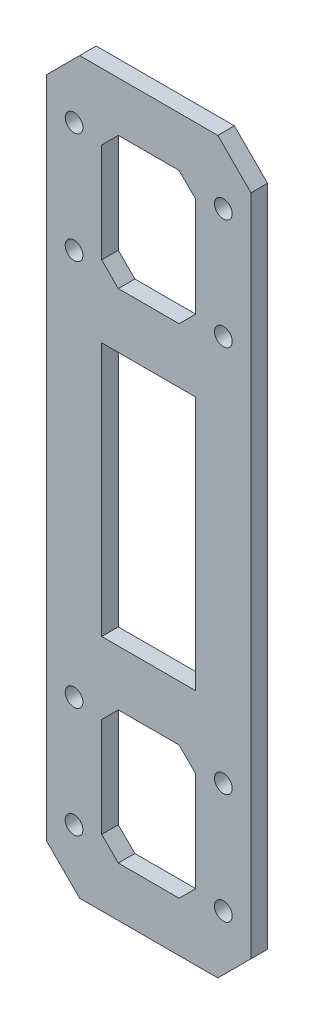
ISO-10303-21;
HEADER;
FILE_DESCRIPTION(('STEP AP214'),'2;1');
FILE_NAME('part.step','',(''),(''),'','','');
FILE_SCHEMA(('AUTOMOTIVE_DESIGN { 1 0 10303 214 1 1 1 1 }'));
ENDSEC;
DATA;
#1=APPLICATION_CONTEXT('core data for automotive mechanical design processes');
#2=APPLICATION_PROTOCOL_DEFINITION('international standard','automotive_design',2000,#1);
#3=PRODUCT_CONTEXT('',#1,'mechanical');
#4=PRODUCT('Part','Part','',(#3));
#5=PRODUCT_RELATED_PRODUCT_CATEGORY('part','',(#4));
#6=PRODUCT_DEFINITION_FORMATION('','',#4);
#7=PRODUCT_DEFINITION_CONTEXT('part definition',#1,'design');
#8=PRODUCT_DEFINITION('design','',#6,#7);
#9=PRODUCT_DEFINITION_SHAPE('','',#8);
#10=(LENGTH_UNIT() NAMED_UNIT(*) SI_UNIT(.MILLI.,.METRE.));
#11=(NAMED_UNIT(*) PLANE_ANGLE_UNIT() SI_UNIT($,.RADIAN.));
#12=(NAMED_UNIT(*) SI_UNIT($,.STERADIAN.) SOLID_ANGLE_UNIT());
#13=UNCERTAINTY_MEASURE_WITH_UNIT(LENGTH_MEASURE(1.E-05),#10,'distance_accuracy_value','');
#14=(GEOMETRIC_REPRESENTATION_CONTEXT(3) GLOBAL_UNCERTAINTY_ASSIGNED_CONTEXT((#13)) GLOBAL_UNIT_ASSIGNED_CONTEXT((#10,
#11,#12)) REPRESENTATION_CONTEXT('',''));
#15=CARTESIAN_POINT('',(0.,0.,0.));
#16=DIRECTION('',(0.,0.,1.));
#17=DIRECTION('',(1.,0.,0.));
#18=AXIS2_PLACEMENT_3D('',#15,#16,#17);
#19=CARTESIAN_POINT('',(0.,0.,3.));
#20=DIRECTION('',(0.,0.,-1.));
#21=DIRECTION('',(-1.,0.,0.));
#22=AXIS2_PLACEMENT_3D('',#19,#20,#21);
#23=PLANE('',#22);
#24=DIRECTION('',(1.,0.,0.));
#25=VECTOR('',#24,1.);
#26=CARTESIAN_POINT('',(10.,37.,3.));
#27=LINE('',#26,#25);
#28=CARTESIAN_POINT('',(10.,37.,3.));
#29=VERTEX_POINT('',#28);
#30=CARTESIAN_POINT('',(27.,37.,3.));
#31=VERTEX_POINT('',#30);
#32=EDGE_CURVE('E232',#29,#31,#27,.T.);
#33=ORIENTED_EDGE('',*,*,#32,.F.);
#34=DIRECTION('',(0.,-1.,0.));
#35=VECTOR('',#34,1.);
#36=CARTESIAN_POINT('',(10.,83.,3.));
#37=LINE('',#36,#35);
#38=CARTESIAN_POINT('',(10.,83.,3.));
#39=VERTEX_POINT('',#38);
#40=EDGE_CURVE('E51',#39,#29,#37,.T.);
#41=ORIENTED_EDGE('',*,*,#40,.F.);
#42=DIRECTION('',(-1.,0.,0.));
#43=VECTOR('',#42,1.);
#44=CARTESIAN_POINT('',(10.,83.,3.));
#45=LINE('',#44,#43);
#46=CARTESIAN_POINT('',(27.,83.,3.));
#47=VERTEX_POINT('',#46);
#48=EDGE_CURVE('E238',#47,#39,#45,.T.);
#49=ORIENTED_EDGE('',*,*,#48,.F.);
#50=DIRECTION('',(0.,1.,0.));
#51=VECTOR('',#50,1.);
#52=CARTESIAN_POINT('',(27.,83.,3.));
#53=LINE('',#52,#51);
#54=EDGE_CURVE('E223',#31,#47,#53,.T.);
#55=ORIENTED_EDGE('',*,*,#54,.F.);
#56=EDGE_LOOP('',(#33,#41,#49,#55));
#57=FACE_BOUND('',#56,.T.);
#58=DIRECTION('',(1.,0.,0.));
#59=VECTOR('',#58,1.);
#60=CARTESIAN_POINT('',(10.,93.,3.));
#61=LINE('',#60,#59);
#62=CARTESIAN_POINT('',(13.,93.,3.));
#63=VERTEX_POINT('',#62);
#64=CARTESIAN_POINT('',(24.,93.,3.));
#65=VERTEX_POINT('',#64);
#66=EDGE_CURVE('E277',#63,#65,#61,.T.);
#67=ORIENTED_EDGE('',*,*,#66,.F.);
#68=DIRECTION('',(0.707106781186552,-0.707106781186543,0.));
#69=VECTOR('',#68,1.);
#70=CARTESIAN_POINT('',(52.9999999999999,53.0000000000007,3.));
#71=LINE('',#70,#69);
#72=CARTESIAN_POINT('',(10.,96.,3.));
#73=VERTEX_POINT('',#72);
#74=EDGE_CURVE('E463',#63,#73,#71,.F.);
#75=ORIENTED_EDGE('',*,*,#74,.T.);
#76=DIRECTION('',(0.,-1.,0.));
#77=VECTOR('',#76,1.);
#78=CARTESIAN_POINT('',(9.99999999999999,117.,3.));
#79=LINE('',#78,#77);
#80=CARTESIAN_POINT('',(10.,114.,3.));
#81=VERTEX_POINT('',#80);
#82=EDGE_CURVE('E274',#81,#73,#79,.T.);
#83=ORIENTED_EDGE('',*,*,#82,.F.);
#84=DIRECTION('',(-0.707106781186544,-0.707106781186551,0.));
#85=VECTOR('',#84,1.);
#86=CARTESIAN_POINT('',(-52.,51.9999999999995,3.));
#87=LINE('',#86,#85);
#88=CARTESIAN_POINT('',(13.,117.,3.));
#89=VERTEX_POINT('',#88);
#90=EDGE_CURVE('E467',#81,#89,#87,.F.);
#91=ORIENTED_EDGE('',*,*,#90,.T.);
#92=DIRECTION('',(-1.,0.,0.));
#93=VECTOR('',#92,1.);
#94=CARTESIAN_POINT('',(9.99999999999999,117.,3.));
#95=LINE('',#94,#93);
#96=CARTESIAN_POINT('',(24.,117.,3.));
#97=VERTEX_POINT('',#96);
#98=EDGE_CURVE('E264',#97,#89,#95,.T.);
#99=ORIENTED_EDGE('',*,*,#98,.F.);
#100=DIRECTION('',(-0.707106781186551,0.707106781186544,0.));
#101=VECTOR('',#100,1.);
#102=CARTESIAN_POINT('',(70.4999999999999,70.5000000000005,3.));
#103=LINE('',#102,#101);
#104=CARTESIAN_POINT('',(27.,114.,3.));
#105=VERTEX_POINT('',#104);
#106=EDGE_CURVE('E471',#97,#105,#103,.F.);
#107=ORIENTED_EDGE('',*,*,#106,.T.);
#108=DIRECTION('',(0.,1.,0.));
#109=VECTOR('',#108,1.);
#110=CARTESIAN_POINT('',(27.,117.,3.));
#111=LINE('',#110,#109);
#112=CARTESIAN_POINT('',(27.,96.,3.));
#113=VERTEX_POINT('',#112);
#114=EDGE_CURVE('E281',#113,#105,#111,.T.);
#115=ORIENTED_EDGE('',*,*,#114,.F.);
#116=DIRECTION('',(0.707106781186544,0.707106781186551,0.));
#117=VECTOR('',#116,1.);
#118=CARTESIAN_POINT('',(-34.4999999999999,34.4999999999996,3.));
#119=LINE('',#118,#117);
#120=EDGE_CURVE('E459',#113,#65,#119,.F.);
#121=ORIENTED_EDGE('',*,*,#120,.T.);
#122=EDGE_LOOP('',(#67,#75,#83,#91,#99,#107,#115,#121));
#123=FACE_BOUND('',#122,.T.);
#124=DIRECTION('',(1.,0.,0.));
#125=VECTOR('',#124,1.);
#126=CARTESIAN_POINT('',(10.,3.00000000000001,3.));
#127=LINE('',#126,#125);
#128=CARTESIAN_POINT('',(13.,3.00000000000001,3.));
#129=VERTEX_POINT('',#128);
#130=CARTESIAN_POINT('',(24.,3.00000000000001,3.));
#131=VERTEX_POINT('',#130);
#132=EDGE_CURVE('E300',#129,#131,#127,.T.);
#133=ORIENTED_EDGE('',*,*,#132,.F.);
#134=DIRECTION('',(0.707106781186552,-0.707106781186543,0.));
#135=VECTOR('',#134,1.);
#136=CARTESIAN_POINT('',(7.99999999999994,8.00000000000005,3.));
#137=LINE('',#136,#135);
#138=CARTESIAN_POINT('',(10.,6.00000000000001,3.));
#139=VERTEX_POINT('',#138);
#140=EDGE_CURVE('E443',#129,#139,#137,.F.);
#141=ORIENTED_EDGE('',*,*,#140,.T.);
#142=DIRECTION('',(0.,-1.,0.));
#143=VECTOR('',#142,1.);
#144=CARTESIAN_POINT('',(10.,27.,3.));
#145=LINE('',#144,#143);
#146=CARTESIAN_POINT('',(10.,24.,3.));
#147=VERTEX_POINT('',#146);
#148=EDGE_CURVE('E257',#147,#139,#145,.T.);
#149=ORIENTED_EDGE('',*,*,#148,.F.);
#150=DIRECTION('',(-0.707106781186544,-0.707106781186551,0.));
#151=VECTOR('',#150,1.);
#152=CARTESIAN_POINT('',(-6.99999999999995,6.99999999999989,3.));
#153=LINE('',#152,#151);
#154=CARTESIAN_POINT('',(13.,27.,3.));
#155=VERTEX_POINT('',#154);
#156=EDGE_CURVE('E455',#147,#155,#153,.F.);
#157=ORIENTED_EDGE('',*,*,#156,.T.);
#158=DIRECTION('',(-1.,0.,0.));
#159=VECTOR('',#158,1.);
#160=CARTESIAN_POINT('',(10.,27.,3.));
#161=LINE('',#160,#159);
#162=CARTESIAN_POINT('',(24.,27.,3.));
#163=VERTEX_POINT('',#162);
#164=EDGE_CURVE('E290',#163,#155,#161,.T.);
#165=ORIENTED_EDGE('',*,*,#164,.F.);
#166=DIRECTION('',(-0.707106781186553,0.707106781186542,0.));
#167=VECTOR('',#166,1.);
#168=CARTESIAN_POINT('',(25.4999999999998,25.5000000000002,3.));
#169=LINE('',#168,#167);
#170=CARTESIAN_POINT('',(27.,24.,3.));
#171=VERTEX_POINT('',#170);
#172=EDGE_CURVE('E451',#163,#171,#169,.F.);
#173=ORIENTED_EDGE('',*,*,#172,.T.);
#174=DIRECTION('',(0.,1.,0.));
#175=VECTOR('',#174,1.);
#176=CARTESIAN_POINT('',(27.,27.,3.));
#177=LINE('',#176,#175);
#178=CARTESIAN_POINT('',(27.,6.00000000000004,3.));
#179=VERTEX_POINT('',#178);
#180=EDGE_CURVE('E303',#179,#171,#177,.T.);
#181=ORIENTED_EDGE('',*,*,#180,.F.);
#182=DIRECTION('',(0.707106781186543,0.707106781186552,0.));
#183=VECTOR('',#182,1.);
#184=CARTESIAN_POINT('',(10.5000000000002,-10.5,3.));
#185=LINE('',#184,#183);
#186=EDGE_CURVE('E447',#179,#131,#185,.F.);
#187=ORIENTED_EDGE('',*,*,#186,.T.);
#188=EDGE_LOOP('',(#133,#141,#149,#157,#165,#173,#181,#187));
#189=FACE_BOUND('',#188,.T.);
#190=DIRECTION('',(0.,1.,0.));
#191=VECTOR('',#190,1.);
#192=CARTESIAN_POINT('',(37.,0.,3.));
#193=LINE('',#192,#191);
#194=CARTESIAN_POINT('',(37.,0.,3.));
#195=VERTEX_POINT('',#194);
#196=CARTESIAN_POINT('',(37.,120.,3.));
#197=VERTEX_POINT('',#196);
#198=EDGE_CURVE('E359',#195,#197,#193,.T.);
#199=ORIENTED_EDGE('',*,*,#198,.T.);
#200=DIRECTION('',(-0.70710678118655,0.707106781186545,0.));
#201=VECTOR('',#200,1.);
#202=CARTESIAN_POINT('',(37.,120.,3.));
#203=LINE('',#202,#201);
#204=CARTESIAN_POINT('',(31.,126.,3.));
#205=VERTEX_POINT('',#204);
#206=EDGE_CURVE('E378',#197,#205,#203,.T.);
#207=ORIENTED_EDGE('',*,*,#206,.T.);
#208=DIRECTION('',(-1.,0.,0.));
#209=VECTOR('',#208,1.);
#210=CARTESIAN_POINT('',(0.,126.,3.));
#211=LINE('',#210,#209);
#212=CARTESIAN_POINT('',(6.00000000000003,126.,3.));
#213=VERTEX_POINT('',#212);
#214=EDGE_CURVE('E251',#205,#213,#211,.T.);
#215=ORIENTED_EDGE('',*,*,#214,.T.);
#216=DIRECTION('',(-0.707106781186548,-0.707106781186548,0.));
#217=VECTOR('',#216,1.);
#218=CARTESIAN_POINT('',(6.00000000000003,126.,3.));
#219=LINE('',#218,#217);
#220=CARTESIAN_POINT('',(0.,120.,3.));
#221=VERTEX_POINT('',#220);
#222=EDGE_CURVE('E376',#213,#221,#219,.T.);
#223=ORIENTED_EDGE('',*,*,#222,.T.);
#224=DIRECTION('',(0.,-1.,0.));
#225=VECTOR('',#224,1.);
#226=CARTESIAN_POINT('',(0.,0.,3.));
#227=LINE('',#226,#225);
#228=CARTESIAN_POINT('',(0.,0.,3.));
#229=VERTEX_POINT('',#228);
#230=EDGE_CURVE('E356',#221,#229,#227,.T.);
#231=ORIENTED_EDGE('',*,*,#230,.T.);
#232=DIRECTION('',(0.70710678118655,-0.707106781186545,0.));
#233=VECTOR('',#232,1.);
#234=CARTESIAN_POINT('',(0.,0.,3.));
#235=LINE('',#234,#233);
#236=CARTESIAN_POINT('',(6.00000000000005,-6.,3.));
#237=VERTEX_POINT('',#236);
#238=EDGE_CURVE('E372',#229,#237,#235,.T.);
#239=ORIENTED_EDGE('',*,*,#238,.T.);
#240=DIRECTION('',(1.,0.,0.));
#241=VECTOR('',#240,1.);
#242=CARTESIAN_POINT('',(0.,-6.,3.));
#243=LINE('',#242,#241);
#244=CARTESIAN_POINT('',(31.,-6.,3.));
#245=VERTEX_POINT('',#244);
#246=EDGE_CURVE('E245',#237,#245,#243,.T.);
#247=ORIENTED_EDGE('',*,*,#246,.T.);
#248=DIRECTION('',(0.707106781186549,0.707106781186546,0.));
#249=VECTOR('',#248,1.);
#250=CARTESIAN_POINT('',(31.,-6.,3.));
#251=LINE('',#250,#249);
#252=EDGE_CURVE('E374',#245,#195,#251,.T.);
#253=ORIENTED_EDGE('',*,*,#252,.T.);
#254=EDGE_LOOP('',(#199,#207,#215,#223,#231,#239,#247,#253));
#255=FACE_BOUND('',#254,.T.);
#256=CARTESIAN_POINT('',(5.,115.,3.));
#257=DIRECTION('',(0.,0.,1.));
#258=DIRECTION('',(1.,0.,0.));
#259=AXIS2_PLACEMENT_3D('',#256,#257,#258);
#260=CIRCLE('',#259,1.6);
#261=CARTESIAN_POINT('',(6.6,115.,3.));
#262=VERTEX_POINT('',#261);
#263=EDGE_CURVE('E350',#262,#262,#260,.T.);
#264=ORIENTED_EDGE('',*,*,#263,.F.);
#265=EDGE_LOOP('',(#264));
#266=FACE_BOUND('',#265,.T.);
#267=CARTESIAN_POINT('',(32.,115.,3.));
#268=DIRECTION('',(0.,0.,1.));
#269=DIRECTION('',(1.,0.,0.));
#270=AXIS2_PLACEMENT_3D('',#267,#268,#269);
#271=CIRCLE('',#270,1.6);
#272=CARTESIAN_POINT('',(33.6,115.,3.));
#273=VERTEX_POINT('',#272);
#274=EDGE_CURVE('E344',#273,#273,#271,.T.);
#275=ORIENTED_EDGE('',*,*,#274,.F.);
#276=EDGE_LOOP('',(#275));
#277=FACE_BOUND('',#276,.T.);
#278=CARTESIAN_POINT('',(5.,95.,3.));
#279=DIRECTION('',(0.,0.,1.));
#280=DIRECTION('',(1.,0.,0.));
#281=AXIS2_PLACEMENT_3D('',#278,#279,#280);
#282=CIRCLE('',#281,1.6);
#283=CARTESIAN_POINT('',(6.6,95.,3.));
#284=VERTEX_POINT('',#283);
#285=EDGE_CURVE('E338',#284,#284,#282,.T.);
#286=ORIENTED_EDGE('',*,*,#285,.F.);
#287=EDGE_LOOP('',(#286));
#288=FACE_BOUND('',#287,.T.);
#289=CARTESIAN_POINT('',(32.,95.,3.));
#290=DIRECTION('',(0.,0.,1.));
#291=DIRECTION('',(1.,0.,0.));
#292=AXIS2_PLACEMENT_3D('',#289,#290,#291);
#293=CIRCLE('',#292,1.60000000000001);
#294=CARTESIAN_POINT('',(33.6,95.,3.));
#295=VERTEX_POINT('',#294);
#296=EDGE_CURVE('E332',#295,#295,#293,.T.);
#297=ORIENTED_EDGE('',*,*,#296,.F.);
#298=EDGE_LOOP('',(#297));
#299=FACE_BOUND('',#298,.T.);
#300=CARTESIAN_POINT('',(5.,25.,3.));
#301=DIRECTION('',(0.,0.,1.));
#302=DIRECTION('',(1.,0.,0.));
#303=AXIS2_PLACEMENT_3D('',#300,#301,#302);
#304=CIRCLE('',#303,1.6);
#305=CARTESIAN_POINT('',(6.6,25.,3.));
#306=VERTEX_POINT('',#305);
#307=EDGE_CURVE('E326',#306,#306,#304,.T.);
#308=ORIENTED_EDGE('',*,*,#307,.F.);
#309=EDGE_LOOP('',(#308));
#310=FACE_BOUND('',#309,.T.);
#311=CARTESIAN_POINT('',(32.,25.,3.));
#312=DIRECTION('',(0.,0.,1.));
#313=DIRECTION('',(1.,0.,0.));
#314=AXIS2_PLACEMENT_3D('',#311,#312,#313);
#315=CIRCLE('',#314,1.6);
#316=CARTESIAN_POINT('',(33.6,25.,3.));
#317=VERTEX_POINT('',#316);
#318=EDGE_CURVE('E320',#317,#317,#315,.T.);
#319=ORIENTED_EDGE('',*,*,#318,.F.);
#320=EDGE_LOOP('',(#319));
#321=FACE_BOUND('',#320,.T.);
#322=CARTESIAN_POINT('',(5.,5.,3.));
#323=DIRECTION('',(0.,0.,1.));
#324=DIRECTION('',(1.,0.,0.));
#325=AXIS2_PLACEMENT_3D('',#322,#323,#324);
#326=CIRCLE('',#325,1.6);
#327=CARTESIAN_POINT('',(6.6,5.,3.));
#328=VERTEX_POINT('',#327);
#329=EDGE_CURVE('E314',#328,#328,#326,.T.);
#330=ORIENTED_EDGE('',*,*,#329,.F.);
#331=EDGE_LOOP('',(#330));
#332=FACE_BOUND('',#331,.T.);
#333=CARTESIAN_POINT('',(32.,5.,3.));
#334=DIRECTION('',(0.,0.,1.));
#335=DIRECTION('',(1.,0.,0.));
#336=AXIS2_PLACEMENT_3D('',#333,#334,#335);
#337=CIRCLE('',#336,1.6);
#338=CARTESIAN_POINT('',(33.6,5.,3.));
#339=VERTEX_POINT('',#338);
#340=EDGE_CURVE('E308',#339,#339,#337,.T.);
#341=ORIENTED_EDGE('',*,*,#340,.F.);
#342=EDGE_LOOP('',(#341));
#343=FACE_BOUND('',#342,.T.);
#344=ADVANCED_FACE('F35',(#57,#123,#189,#255,#266,#277,#288,#299,#310,#321,#332,#343),#23,.F.);
#345=CARTESIAN_POINT('',(0.,0.,0.));
#346=DIRECTION('',(0.,0.,-1.));
#347=DIRECTION('',(-1.,0.,0.));
#348=AXIS2_PLACEMENT_3D('',#345,#346,#347);
#349=PLANE('',#348);
#350=DIRECTION('',(0.,1.,0.));
#351=VECTOR('',#350,1.);
#352=CARTESIAN_POINT('',(10.,0.,0.));
#353=LINE('',#352,#351);
#354=CARTESIAN_POINT('',(10.,37.,0.));
#355=VERTEX_POINT('',#354);
#356=CARTESIAN_POINT('',(10.,83.,0.));
#357=VERTEX_POINT('',#356);
#358=EDGE_CURVE('E11',#355,#357,#353,.T.);
#359=ORIENTED_EDGE('',*,*,#358,.F.);
#360=DIRECTION('',(-1.,0.,0.));
#361=VECTOR('',#360,1.);
#362=CARTESIAN_POINT('',(0.,37.,0.));
#363=LINE('',#362,#361);
#364=CARTESIAN_POINT('',(27.,37.,0.));
#365=VERTEX_POINT('',#364);
#366=EDGE_CURVE('E475',#365,#355,#363,.T.);
#367=ORIENTED_EDGE('',*,*,#366,.F.);
#368=DIRECTION('',(0.,-1.,0.));
#369=VECTOR('',#368,1.);
#370=CARTESIAN_POINT('',(27.,0.,0.));
#371=LINE('',#370,#369);
#372=CARTESIAN_POINT('',(27.,83.,0.));
#373=VERTEX_POINT('',#372);
#374=EDGE_CURVE('E226',#373,#365,#371,.T.);
#375=ORIENTED_EDGE('',*,*,#374,.F.);
#376=DIRECTION('',(1.,0.,0.));
#377=VECTOR('',#376,1.);
#378=CARTESIAN_POINT('',(0.,83.,0.));
#379=LINE('',#378,#377);
#380=EDGE_CURVE('E44',#357,#373,#379,.T.);
#381=ORIENTED_EDGE('',*,*,#380,.F.);
#382=EDGE_LOOP('',(#359,#367,#375,#381));
#383=FACE_BOUND('',#382,.T.);
#384=DIRECTION('',(-1.,0.,0.));
#385=VECTOR('',#384,1.);
#386=CARTESIAN_POINT('',(9.99999999999999,117.,0.));
#387=LINE('',#386,#385);
#388=CARTESIAN_POINT('',(24.,117.,0.));
#389=VERTEX_POINT('',#388);
#390=CARTESIAN_POINT('',(13.,117.,0.));
#391=VERTEX_POINT('',#390);
#392=EDGE_CURVE('E270',#389,#391,#387,.T.);
#393=ORIENTED_EDGE('',*,*,#392,.T.);
#394=DIRECTION('',(0.707106781186544,0.707106781186551,0.));
#395=VECTOR('',#394,1.);
#396=CARTESIAN_POINT('',(10.,114.,0.));
#397=LINE('',#396,#395);
#398=CARTESIAN_POINT('',(10.,114.,0.));
#399=VERTEX_POINT('',#398);
#400=EDGE_CURVE('E469',#391,#399,#397,.F.);
#401=ORIENTED_EDGE('',*,*,#400,.T.);
#402=DIRECTION('',(0.,-1.,0.));
#403=VECTOR('',#402,1.);
#404=CARTESIAN_POINT('',(9.99999999999999,117.,0.));
#405=LINE('',#404,#403);
#406=CARTESIAN_POINT('',(10.,96.,0.));
#407=VERTEX_POINT('',#406);
#408=EDGE_CURVE('E260',#399,#407,#405,.T.);
#409=ORIENTED_EDGE('',*,*,#408,.T.);
#410=DIRECTION('',(-0.707106781186552,0.707106781186543,0.));
#411=VECTOR('',#410,1.);
#412=CARTESIAN_POINT('',(13.,93.,0.));
#413=LINE('',#412,#411);
#414=CARTESIAN_POINT('',(13.,93.,0.));
#415=VERTEX_POINT('',#414);
#416=EDGE_CURVE('E465',#407,#415,#413,.F.);
#417=ORIENTED_EDGE('',*,*,#416,.T.);
#418=DIRECTION('',(1.,0.,0.));
#419=VECTOR('',#418,1.);
#420=CARTESIAN_POINT('',(10.,93.,0.));
#421=LINE('',#420,#419);
#422=CARTESIAN_POINT('',(24.,93.,0.));
#423=VERTEX_POINT('',#422);
#424=EDGE_CURVE('E263',#415,#423,#421,.T.);
#425=ORIENTED_EDGE('',*,*,#424,.T.);
#426=DIRECTION('',(-0.707106781186544,-0.707106781186551,0.));
#427=VECTOR('',#426,1.);
#428=CARTESIAN_POINT('',(27.,96.,0.));
#429=LINE('',#428,#427);
#430=CARTESIAN_POINT('',(27.,96.,0.));
#431=VERTEX_POINT('',#430);
#432=EDGE_CURVE('E461',#423,#431,#429,.F.);
#433=ORIENTED_EDGE('',*,*,#432,.T.);
#434=DIRECTION('',(0.,1.,0.));
#435=VECTOR('',#434,1.);
#436=CARTESIAN_POINT('',(27.,117.,0.));
#437=LINE('',#436,#435);
#438=CARTESIAN_POINT('',(27.,114.,0.));
#439=VERTEX_POINT('',#438);
#440=EDGE_CURVE('E267',#431,#439,#437,.T.);
#441=ORIENTED_EDGE('',*,*,#440,.T.);
#442=DIRECTION('',(0.707106781186551,-0.707106781186544,0.));
#443=VECTOR('',#442,1.);
#444=CARTESIAN_POINT('',(24.,117.,0.));
#445=LINE('',#444,#443);
#446=EDGE_CURVE('E473',#439,#389,#445,.F.);
#447=ORIENTED_EDGE('',*,*,#446,.T.);
#448=EDGE_LOOP('',(#393,#401,#409,#417,#425,#433,#441,#447));
#449=FACE_BOUND('',#448,.T.);
#450=DIRECTION('',(-1.,0.,0.));
#451=VECTOR('',#450,1.);
#452=CARTESIAN_POINT('',(10.,27.,0.));
#453=LINE('',#452,#451);
#454=CARTESIAN_POINT('',(24.,27.,0.));
#455=VERTEX_POINT('',#454);
#456=CARTESIAN_POINT('',(13.,27.,0.));
#457=VERTEX_POINT('',#456);
#458=EDGE_CURVE('E278',#455,#457,#453,.T.);
#459=ORIENTED_EDGE('',*,*,#458,.T.);
#460=DIRECTION('',(0.707106781186544,0.707106781186551,0.));
#461=VECTOR('',#460,1.);
#462=CARTESIAN_POINT('',(10.,24.,0.));
#463=LINE('',#462,#461);
#464=CARTESIAN_POINT('',(10.,24.,0.));
#465=VERTEX_POINT('',#464);
#466=EDGE_CURVE('E457',#457,#465,#463,.F.);
#467=ORIENTED_EDGE('',*,*,#466,.T.);
#468=DIRECTION('',(0.,-1.,0.));
#469=VECTOR('',#468,1.);
#470=CARTESIAN_POINT('',(10.,27.,0.));
#471=LINE('',#470,#469);
#472=CARTESIAN_POINT('',(10.,6.00000000000001,0.));
#473=VERTEX_POINT('',#472);
#474=EDGE_CURVE('E286',#465,#473,#471,.T.);
#475=ORIENTED_EDGE('',*,*,#474,.T.);
#476=DIRECTION('',(-0.707106781186552,0.707106781186543,0.));
#477=VECTOR('',#476,1.);
#478=CARTESIAN_POINT('',(13.,3.00000000000001,0.));
#479=LINE('',#478,#477);
#480=CARTESIAN_POINT('',(13.,3.00000000000001,0.));
#481=VERTEX_POINT('',#480);
#482=EDGE_CURVE('E445',#473,#481,#479,.F.);
#483=ORIENTED_EDGE('',*,*,#482,.T.);
#484=DIRECTION('',(1.,0.,0.));
#485=VECTOR('',#484,1.);
#486=CARTESIAN_POINT('',(10.,3.00000000000001,0.));
#487=LINE('',#486,#485);
#488=CARTESIAN_POINT('',(24.,3.00000000000001,0.));
#489=VERTEX_POINT('',#488);
#490=EDGE_CURVE('E289',#481,#489,#487,.T.);
#491=ORIENTED_EDGE('',*,*,#490,.T.);
#492=DIRECTION('',(-0.707106781186543,-0.707106781186552,0.));
#493=VECTOR('',#492,1.);
#494=CARTESIAN_POINT('',(27.,6.00000000000004,0.));
#495=LINE('',#494,#493);
#496=CARTESIAN_POINT('',(27.,6.00000000000004,0.));
#497=VERTEX_POINT('',#496);
#498=EDGE_CURVE('E449',#489,#497,#495,.F.);
#499=ORIENTED_EDGE('',*,*,#498,.T.);
#500=DIRECTION('',(0.,1.,0.));
#501=VECTOR('',#500,1.);
#502=CARTESIAN_POINT('',(27.,27.,0.));
#503=LINE('',#502,#501);
#504=CARTESIAN_POINT('',(27.,24.,0.));
#505=VERTEX_POINT('',#504);
#506=EDGE_CURVE('E293',#497,#505,#503,.T.);
#507=ORIENTED_EDGE('',*,*,#506,.T.);
#508=DIRECTION('',(0.707106781186553,-0.707106781186542,0.));
#509=VECTOR('',#508,1.);
#510=CARTESIAN_POINT('',(24.,27.,0.));
#511=LINE('',#510,#509);
#512=EDGE_CURVE('E453',#505,#455,#511,.F.);
#513=ORIENTED_EDGE('',*,*,#512,.T.);
#514=EDGE_LOOP('',(#459,#467,#475,#483,#491,#499,#507,#513));
#515=FACE_BOUND('',#514,.T.);
#516=CARTESIAN_POINT('',(5.,5.,0.));
#517=DIRECTION('',(0.,0.,1.));
#518=DIRECTION('',(1.,0.,0.));
#519=AXIS2_PLACEMENT_3D('',#516,#517,#518);
#520=CIRCLE('',#519,1.6);
#521=CARTESIAN_POINT('',(6.6,5.,0.));
#522=VERTEX_POINT('',#521);
#523=EDGE_CURVE('E311',#522,#522,#520,.T.);
#524=ORIENTED_EDGE('',*,*,#523,.T.);
#525=EDGE_LOOP('',(#524));
#526=FACE_BOUND('',#525,.T.);
#527=CARTESIAN_POINT('',(5.,25.,0.));
#528=DIRECTION('',(0.,0.,1.));
#529=DIRECTION('',(1.,0.,0.));
#530=AXIS2_PLACEMENT_3D('',#527,#528,#529);
#531=CIRCLE('',#530,1.6);
#532=CARTESIAN_POINT('',(6.6,25.,0.));
#533=VERTEX_POINT('',#532);
#534=EDGE_CURVE('E323',#533,#533,#531,.T.);
#535=ORIENTED_EDGE('',*,*,#534,.T.);
#536=EDGE_LOOP('',(#535));
#537=FACE_BOUND('',#536,.T.);
#538=CARTESIAN_POINT('',(5.,95.,0.));
#539=DIRECTION('',(0.,0.,1.));
#540=DIRECTION('',(1.,0.,0.));
#541=AXIS2_PLACEMENT_3D('',#538,#539,#540);
#542=CIRCLE('',#541,1.6);
#543=CARTESIAN_POINT('',(6.6,95.,0.));
#544=VERTEX_POINT('',#543);
#545=EDGE_CURVE('E335',#544,#544,#542,.T.);
#546=ORIENTED_EDGE('',*,*,#545,.T.);
#547=EDGE_LOOP('',(#546));
#548=FACE_BOUND('',#547,.T.);
#549=CARTESIAN_POINT('',(5.,115.,0.));
#550=DIRECTION('',(0.,0.,1.));
#551=DIRECTION('',(1.,0.,0.));
#552=AXIS2_PLACEMENT_3D('',#549,#550,#551);
#553=CIRCLE('',#552,1.6);
#554=CARTESIAN_POINT('',(6.6,115.,0.));
#555=VERTEX_POINT('',#554);
#556=EDGE_CURVE('E347',#555,#555,#553,.T.);
#557=ORIENTED_EDGE('',*,*,#556,.T.);
#558=EDGE_LOOP('',(#557));
#559=FACE_BOUND('',#558,.T.);
#560=DIRECTION('',(-1.,0.,0.));
#561=VECTOR('',#560,1.);
#562=CARTESIAN_POINT('',(0.,126.,0.));
#563=LINE('',#562,#561);
#564=CARTESIAN_POINT('',(31.,126.,0.));
#565=VERTEX_POINT('',#564);
#566=CARTESIAN_POINT('',(6.00000000000003,126.,0.));
#567=VERTEX_POINT('',#566);
#568=EDGE_CURVE('E254',#565,#567,#563,.T.);
#569=ORIENTED_EDGE('',*,*,#568,.F.);
#570=DIRECTION('',(0.70710678118655,-0.707106781186545,0.));
#571=VECTOR('',#570,1.);
#572=CARTESIAN_POINT('',(78.4999999999999,78.5000000000004,0.));
#573=LINE('',#572,#571);
#574=CARTESIAN_POINT('',(37.,120.,0.));
#575=VERTEX_POINT('',#574);
#576=EDGE_CURVE('E391',#565,#575,#573,.T.);
#577=ORIENTED_EDGE('',*,*,#576,.T.);
#578=DIRECTION('',(0.,1.,0.));
#579=VECTOR('',#578,1.);
#580=CARTESIAN_POINT('',(37.,0.,0.));
#581=LINE('',#580,#579);
#582=CARTESIAN_POINT('',(37.,0.,0.));
#583=VERTEX_POINT('',#582);
#584=EDGE_CURVE('E360',#583,#575,#581,.T.);
#585=ORIENTED_EDGE('',*,*,#584,.F.);
#586=DIRECTION('',(-0.707106781186549,-0.707106781186546,0.));
#587=VECTOR('',#586,1.);
#588=CARTESIAN_POINT('',(18.4999999999999,-18.5,0.));
#589=LINE('',#588,#587);
#590=CARTESIAN_POINT('',(31.,-6.,0.));
#591=VERTEX_POINT('',#590);
#592=EDGE_CURVE('E387',#583,#591,#589,.T.);
#593=ORIENTED_EDGE('',*,*,#592,.T.);
#594=DIRECTION('',(1.,0.,0.));
#595=VECTOR('',#594,1.);
#596=CARTESIAN_POINT('',(0.,-6.,0.));
#597=LINE('',#596,#595);
#598=CARTESIAN_POINT('',(6.00000000000005,-6.,0.));
#599=VERTEX_POINT('',#598);
#600=EDGE_CURVE('E248',#599,#591,#597,.T.);
#601=ORIENTED_EDGE('',*,*,#600,.F.);
#602=DIRECTION('',(-0.70710678118655,0.707106781186545,0.));
#603=VECTOR('',#602,1.);
#604=CARTESIAN_POINT('',(0.,0.,0.));
#605=LINE('',#604,#603);
#606=CARTESIAN_POINT('',(0.,0.,0.));
#607=VERTEX_POINT('',#606);
#608=EDGE_CURVE('E385',#599,#607,#605,.T.);
#609=ORIENTED_EDGE('',*,*,#608,.T.);
#610=DIRECTION('',(0.,-1.,0.));
#611=VECTOR('',#610,1.);
#612=CARTESIAN_POINT('',(0.,0.,0.));
#613=LINE('',#612,#611);
#614=CARTESIAN_POINT('',(0.,120.,0.));
#615=VERTEX_POINT('',#614);
#616=EDGE_CURVE('E353',#615,#607,#613,.T.);
#617=ORIENTED_EDGE('',*,*,#616,.F.);
#618=DIRECTION('',(0.707106781186548,0.707106781186548,0.));
#619=VECTOR('',#618,1.);
#620=CARTESIAN_POINT('',(-60.,60.,0.));
#621=LINE('',#620,#619);
#622=EDGE_CURVE('E389',#615,#567,#621,.T.);
#623=ORIENTED_EDGE('',*,*,#622,.T.);
#624=EDGE_LOOP('',(#569,#577,#585,#593,#601,#609,#617,#623));
#625=FACE_BOUND('',#624,.T.);
#626=CARTESIAN_POINT('',(32.,115.,0.));
#627=DIRECTION('',(0.,0.,1.));
#628=DIRECTION('',(1.,0.,0.));
#629=AXIS2_PLACEMENT_3D('',#626,#627,#628);
#630=CIRCLE('',#629,1.6);
#631=CARTESIAN_POINT('',(33.6,115.,0.));
#632=VERTEX_POINT('',#631);
#633=EDGE_CURVE('E341',#632,#632,#630,.T.);
#634=ORIENTED_EDGE('',*,*,#633,.T.);
#635=EDGE_LOOP('',(#634));
#636=FACE_BOUND('',#635,.T.);
#637=CARTESIAN_POINT('',(32.,95.,0.));
#638=DIRECTION('',(0.,0.,1.));
#639=DIRECTION('',(1.,0.,0.));
#640=AXIS2_PLACEMENT_3D('',#637,#638,#639);
#641=CIRCLE('',#640,1.60000000000001);
#642=CARTESIAN_POINT('',(33.6,95.,0.));
#643=VERTEX_POINT('',#642);
#644=EDGE_CURVE('E329',#643,#643,#641,.T.);
#645=ORIENTED_EDGE('',*,*,#644,.T.);
#646=EDGE_LOOP('',(#645));
#647=FACE_BOUND('',#646,.T.);
#648=CARTESIAN_POINT('',(32.,25.,0.));
#649=DIRECTION('',(0.,0.,1.));
#650=DIRECTION('',(1.,0.,0.));
#651=AXIS2_PLACEMENT_3D('',#648,#649,#650);
#652=CIRCLE('',#651,1.6);
#653=CARTESIAN_POINT('',(33.6,25.,0.));
#654=VERTEX_POINT('',#653);
#655=EDGE_CURVE('E317',#654,#654,#652,.T.);
#656=ORIENTED_EDGE('',*,*,#655,.T.);
#657=EDGE_LOOP('',(#656));
#658=FACE_BOUND('',#657,.T.);
#659=CARTESIAN_POINT('',(32.,5.,0.));
#660=DIRECTION('',(0.,0.,1.));
#661=DIRECTION('',(1.,0.,0.));
#662=AXIS2_PLACEMENT_3D('',#659,#660,#661);
#663=CIRCLE('',#662,1.6);
#664=CARTESIAN_POINT('',(33.6,5.,0.));
#665=VERTEX_POINT('',#664);
#666=EDGE_CURVE('E273',#665,#665,#663,.T.);
#667=ORIENTED_EDGE('',*,*,#666,.T.);
#668=EDGE_LOOP('',(#667));
#669=FACE_BOUND('',#668,.T.);
#670=ADVANCED_FACE('F483',(#383,#449,#515,#526,#537,#548,#559,#625,#636,#647,#658,#669),#349,.T.);
#671=CARTESIAN_POINT('',(0.,0.,3.));
#672=DIRECTION('',(1.,0.,0.));
#673=DIRECTION('',(0.,0.,-1.));
#674=AXIS2_PLACEMENT_3D('',#671,#672,#673);
#675=PLANE('',#674);
#676=ORIENTED_EDGE('',*,*,#230,.F.);
#677=DIRECTION('',(0.,0.,-1.));
#678=VECTOR('',#677,1.);
#679=CARTESIAN_POINT('',(0.,120.,0.));
#680=LINE('',#679,#678);
#681=EDGE_CURVE('E396',#221,#615,#680,.T.);
#682=ORIENTED_EDGE('',*,*,#681,.T.);
#683=ORIENTED_EDGE('',*,*,#616,.T.);
#684=DIRECTION('',(0.,0.,1.));
#685=VECTOR('',#684,1.);
#686=CARTESIAN_POINT('',(0.,0.,3.));
#687=LINE('',#686,#685);
#688=EDGE_CURVE('E393',#607,#229,#687,.T.);
#689=ORIENTED_EDGE('',*,*,#688,.T.);
#690=EDGE_LOOP('',(#676,#682,#683,#689));
#691=FACE_BOUND('',#690,.T.);
#692=ADVANCED_FACE('F502',(#691),#675,.F.);
#693=CARTESIAN_POINT('',(37.,0.,3.));
#694=DIRECTION('',(-1.,0.,0.));
#695=DIRECTION('',(0.,0.,1.));
#696=AXIS2_PLACEMENT_3D('',#693,#694,#695);
#697=PLANE('',#696);
#698=ORIENTED_EDGE('',*,*,#584,.T.);
#699=DIRECTION('',(0.,0.,1.));
#700=VECTOR('',#699,1.);
#701=CARTESIAN_POINT('',(37.,120.,3.));
#702=LINE('',#701,#700);
#703=EDGE_CURVE('E369',#575,#197,#702,.T.);
#704=ORIENTED_EDGE('',*,*,#703,.T.);
#705=ORIENTED_EDGE('',*,*,#198,.F.);
#706=DIRECTION('',(0.,0.,-1.));
#707=VECTOR('',#706,1.);
#708=CARTESIAN_POINT('',(37.,0.,0.));
#709=LINE('',#708,#707);
#710=EDGE_CURVE('E363',#195,#583,#709,.T.);
#711=ORIENTED_EDGE('',*,*,#710,.T.);
#712=EDGE_LOOP('',(#698,#704,#705,#711));
#713=FACE_BOUND('',#712,.T.);
#714=ADVANCED_FACE('F508',(#713),#697,.F.);
#715=CARTESIAN_POINT('',(5.,115.,3.));
#716=DIRECTION('',(0.,0.,-1.));
#717=DIRECTION('',(-1.,0.,0.));
#718=AXIS2_PLACEMENT_3D('',#715,#716,#717);
#719=CYLINDRICAL_SURFACE('',#718,1.6);
#720=ORIENTED_EDGE('',*,*,#263,.T.);
#721=EDGE_LOOP('',(#720));
#722=FACE_BOUND('',#721,.T.);
#723=ORIENTED_EDGE('',*,*,#556,.F.);
#724=EDGE_LOOP('',(#723));
#725=FACE_BOUND('',#724,.T.);
#726=ADVANCED_FACE('F505',(#722,#725),#719,.F.);
#727=CARTESIAN_POINT('',(32.,115.,3.));
#728=DIRECTION('',(0.,0.,-1.));
#729=DIRECTION('',(-1.,0.,0.));
#730=AXIS2_PLACEMENT_3D('',#727,#728,#729);
#731=CYLINDRICAL_SURFACE('',#730,1.6);
#732=ORIENTED_EDGE('',*,*,#274,.T.);
#733=EDGE_LOOP('',(#732));
#734=FACE_BOUND('',#733,.T.);
#735=ORIENTED_EDGE('',*,*,#633,.F.);
#736=EDGE_LOOP('',(#735));
#737=FACE_BOUND('',#736,.T.);
#738=ADVANCED_FACE('F675',(#734,#737),#731,.F.);
#739=CARTESIAN_POINT('',(5.,95.,3.));
#740=DIRECTION('',(0.,0.,-1.));
#741=DIRECTION('',(-1.,0.,0.));
#742=AXIS2_PLACEMENT_3D('',#739,#740,#741);
#743=CYLINDRICAL_SURFACE('',#742,1.6);
#744=ORIENTED_EDGE('',*,*,#285,.T.);
#745=EDGE_LOOP('',(#744));
#746=FACE_BOUND('',#745,.T.);
#747=ORIENTED_EDGE('',*,*,#545,.F.);
#748=EDGE_LOOP('',(#747));
#749=FACE_BOUND('',#748,.T.);
#750=ADVANCED_FACE('F672',(#746,#749),#743,.F.);
#751=CARTESIAN_POINT('',(32.,95.,3.));
#752=DIRECTION('',(0.,0.,-1.));
#753=DIRECTION('',(-1.,0.,0.));
#754=AXIS2_PLACEMENT_3D('',#751,#752,#753);
#755=CYLINDRICAL_SURFACE('',#754,1.60000000000001);
#756=ORIENTED_EDGE('',*,*,#296,.T.);
#757=EDGE_LOOP('',(#756));
#758=FACE_BOUND('',#757,.T.);
#759=ORIENTED_EDGE('',*,*,#644,.F.);
#760=EDGE_LOOP('',(#759));
#761=FACE_BOUND('',#760,.T.);
#762=ADVANCED_FACE('F668',(#758,#761),#755,.F.);
#763=CARTESIAN_POINT('',(5.,25.,3.));
#764=DIRECTION('',(0.,0.,-1.));
#765=DIRECTION('',(-1.,0.,0.));
#766=AXIS2_PLACEMENT_3D('',#763,#764,#765);
#767=CYLINDRICAL_SURFACE('',#766,1.6);
#768=ORIENTED_EDGE('',*,*,#307,.T.);
#769=EDGE_LOOP('',(#768));
#770=FACE_BOUND('',#769,.T.);
#771=ORIENTED_EDGE('',*,*,#534,.F.);
#772=EDGE_LOOP('',(#771));
#773=FACE_BOUND('',#772,.T.);
#774=ADVANCED_FACE('F664',(#770,#773),#767,.F.);
#775=CARTESIAN_POINT('',(32.,25.,3.));
#776=DIRECTION('',(0.,0.,-1.));
#777=DIRECTION('',(-1.,0.,0.));
#778=AXIS2_PLACEMENT_3D('',#775,#776,#777);
#779=CYLINDRICAL_SURFACE('',#778,1.6);
#780=ORIENTED_EDGE('',*,*,#318,.T.);
#781=EDGE_LOOP('',(#780));
#782=FACE_BOUND('',#781,.T.);
#783=ORIENTED_EDGE('',*,*,#655,.F.);
#784=EDGE_LOOP('',(#783));
#785=FACE_BOUND('',#784,.T.);
#786=ADVANCED_FACE('F657',(#782,#785),#779,.F.);
#787=CARTESIAN_POINT('',(5.,5.,3.));
#788=DIRECTION('',(0.,0.,-1.));
#789=DIRECTION('',(-1.,0.,0.));
#790=AXIS2_PLACEMENT_3D('',#787,#788,#789);
#791=CYLINDRICAL_SURFACE('',#790,1.6);
#792=ORIENTED_EDGE('',*,*,#329,.T.);
#793=EDGE_LOOP('',(#792));
#794=FACE_BOUND('',#793,.T.);
#795=ORIENTED_EDGE('',*,*,#523,.F.);
#796=EDGE_LOOP('',(#795));
#797=FACE_BOUND('',#796,.T.);
#798=ADVANCED_FACE('F646',(#794,#797),#791,.F.);
#799=CARTESIAN_POINT('',(32.,5.,3.));
#800=DIRECTION('',(0.,0.,-1.));
#801=DIRECTION('',(-1.,0.,0.));
#802=AXIS2_PLACEMENT_3D('',#799,#800,#801);
#803=CYLINDRICAL_SURFACE('',#802,1.6);
#804=ORIENTED_EDGE('',*,*,#340,.T.);
#805=EDGE_LOOP('',(#804));
#806=FACE_BOUND('',#805,.T.);
#807=ORIENTED_EDGE('',*,*,#666,.F.);
#808=EDGE_LOOP('',(#807));
#809=FACE_BOUND('',#808,.T.);
#810=ADVANCED_FACE('F642',(#806,#809),#803,.F.);
#811=CARTESIAN_POINT('',(10.,27.,0.));
#812=DIRECTION('',(-1.,0.,0.));
#813=DIRECTION('',(0.,-1.,0.));
#814=AXIS2_PLACEMENT_3D('',#811,#812,#813);
#815=PLANE('',#814);
#816=ORIENTED_EDGE('',*,*,#148,.T.);
#817=DIRECTION('',(0.,0.,-1.));
#818=VECTOR('',#817,1.);
#819=CARTESIAN_POINT('',(10.,6.00000000000001,0.));
#820=LINE('',#819,#818);
#821=EDGE_CURVE('E411',#139,#473,#820,.T.);
#822=ORIENTED_EDGE('',*,*,#821,.T.);
#823=ORIENTED_EDGE('',*,*,#474,.F.);
#824=DIRECTION('',(0.,0.,1.));
#825=VECTOR('',#824,1.);
#826=CARTESIAN_POINT('',(10.,24.,3.));
#827=LINE('',#826,#825);
#828=EDGE_CURVE('E408',#465,#147,#827,.T.);
#829=ORIENTED_EDGE('',*,*,#828,.T.);
#830=EDGE_LOOP('',(#816,#822,#823,#829));
#831=FACE_BOUND('',#830,.T.);
#832=ADVANCED_FACE('F645',(#831),#815,.F.);
#833=CARTESIAN_POINT('',(10.,27.,0.));
#834=DIRECTION('',(0.,1.,0.));
#835=DIRECTION('',(-1.,0.,0.));
#836=AXIS2_PLACEMENT_3D('',#833,#834,#835);
#837=PLANE('',#836);
#838=ORIENTED_EDGE('',*,*,#458,.F.);
#839=DIRECTION('',(0.,0.,1.));
#840=VECTOR('',#839,1.);
#841=CARTESIAN_POINT('',(24.,27.,3.));
#842=LINE('',#841,#840);
#843=EDGE_CURVE('E420',#455,#163,#842,.T.);
#844=ORIENTED_EDGE('',*,*,#843,.T.);
#845=ORIENTED_EDGE('',*,*,#164,.T.);
#846=DIRECTION('',(0.,0.,-1.));
#847=VECTOR('',#846,1.);
#848=CARTESIAN_POINT('',(13.,27.,0.));
#849=LINE('',#848,#847);
#850=EDGE_CURVE('E418',#155,#457,#849,.T.);
#851=ORIENTED_EDGE('',*,*,#850,.T.);
#852=EDGE_LOOP('',(#838,#844,#845,#851));
#853=FACE_BOUND('',#852,.T.);
#854=ADVANCED_FACE('F654',(#853),#837,.F.);
#855=CARTESIAN_POINT('',(27.,27.,0.));
#856=DIRECTION('',(1.,0.,0.));
#857=DIRECTION('',(0.,1.,0.));
#858=AXIS2_PLACEMENT_3D('',#855,#856,#857);
#859=PLANE('',#858);
#860=ORIENTED_EDGE('',*,*,#506,.F.);
#861=DIRECTION('',(0.,0.,1.));
#862=VECTOR('',#861,1.);
#863=CARTESIAN_POINT('',(27.,6.00000000000004,3.));
#864=LINE('',#863,#862);
#865=EDGE_CURVE('E415',#497,#179,#864,.T.);
#866=ORIENTED_EDGE('',*,*,#865,.T.);
#867=ORIENTED_EDGE('',*,*,#180,.T.);
#868=DIRECTION('',(0.,0.,-1.));
#869=VECTOR('',#868,1.);
#870=CARTESIAN_POINT('',(27.,24.,0.));
#871=LINE('',#870,#869);
#872=EDGE_CURVE('E413',#171,#505,#871,.T.);
#873=ORIENTED_EDGE('',*,*,#872,.T.);
#874=EDGE_LOOP('',(#860,#866,#867,#873));
#875=FACE_BOUND('',#874,.T.);
#876=ADVANCED_FACE('F737',(#875),#859,.F.);
#877=CARTESIAN_POINT('',(10.,3.00000000000001,0.));
#878=DIRECTION('',(0.,-1.,0.));
#879=DIRECTION('',(0.,0.,-1.));
#880=AXIS2_PLACEMENT_3D('',#877,#878,#879);
#881=PLANE('',#880);
#882=ORIENTED_EDGE('',*,*,#490,.F.);
#883=DIRECTION('',(0.,0.,1.));
#884=VECTOR('',#883,1.);
#885=CARTESIAN_POINT('',(13.,3.00000000000001,3.));
#886=LINE('',#885,#884);
#887=EDGE_CURVE('E405',#481,#129,#886,.T.);
#888=ORIENTED_EDGE('',*,*,#887,.T.);
#889=ORIENTED_EDGE('',*,*,#132,.T.);
#890=DIRECTION('',(0.,0.,-1.));
#891=VECTOR('',#890,1.);
#892=CARTESIAN_POINT('',(24.,3.00000000000001,0.));
#893=LINE('',#892,#891);
#894=EDGE_CURVE('E403',#131,#489,#893,.T.);
#895=ORIENTED_EDGE('',*,*,#894,.T.);
#896=EDGE_LOOP('',(#882,#888,#889,#895));
#897=FACE_BOUND('',#896,.T.);
#898=ADVANCED_FACE('F734',(#897),#881,.F.);
#899=CARTESIAN_POINT('',(9.99999999999999,117.,0.));
#900=DIRECTION('',(-1.,0.,0.));
#901=DIRECTION('',(0.,-1.,0.));
#902=AXIS2_PLACEMENT_3D('',#899,#900,#901);
#903=PLANE('',#902);
#904=ORIENTED_EDGE('',*,*,#82,.T.);
#905=DIRECTION('',(0.,0.,-1.));
#906=VECTOR('',#905,1.);
#907=CARTESIAN_POINT('',(10.,96.,0.));
#908=LINE('',#907,#906);
#909=EDGE_CURVE('E436',#73,#407,#908,.T.);
#910=ORIENTED_EDGE('',*,*,#909,.T.);
#911=ORIENTED_EDGE('',*,*,#408,.F.);
#912=DIRECTION('',(0.,0.,1.));
#913=VECTOR('',#912,1.);
#914=CARTESIAN_POINT('',(10.,114.,3.));
#915=LINE('',#914,#913);
#916=EDGE_CURVE('E433',#399,#81,#915,.T.);
#917=ORIENTED_EDGE('',*,*,#916,.T.);
#918=EDGE_LOOP('',(#904,#910,#911,#917));
#919=FACE_BOUND('',#918,.T.);
#920=ADVANCED_FACE('F600',(#919),#903,.F.);
#921=CARTESIAN_POINT('',(9.99999999999999,117.,0.));
#922=DIRECTION('',(0.,1.,0.));
#923=DIRECTION('',(-1.,0.,0.));
#924=AXIS2_PLACEMENT_3D('',#921,#922,#923);
#925=PLANE('',#924);
#926=ORIENTED_EDGE('',*,*,#98,.T.);
#927=DIRECTION('',(0.,0.,-1.));
#928=VECTOR('',#927,1.);
#929=CARTESIAN_POINT('',(13.,117.,0.));
#930=LINE('',#929,#928);
#931=EDGE_CURVE('E441',#89,#391,#930,.T.);
#932=ORIENTED_EDGE('',*,*,#931,.T.);
#933=ORIENTED_EDGE('',*,*,#392,.F.);
#934=DIRECTION('',(0.,0.,1.));
#935=VECTOR('',#934,1.);
#936=CARTESIAN_POINT('',(24.,117.,3.));
#937=LINE('',#936,#935);
#938=EDGE_CURVE('E438',#389,#97,#937,.T.);
#939=ORIENTED_EDGE('',*,*,#938,.T.);
#940=EDGE_LOOP('',(#926,#932,#933,#939));
#941=FACE_BOUND('',#940,.T.);
#942=ADVANCED_FACE('F619',(#941),#925,.F.);
#943=CARTESIAN_POINT('',(27.,117.,0.));
#944=DIRECTION('',(1.,0.,0.));
#945=DIRECTION('',(0.,1.,0.));
#946=AXIS2_PLACEMENT_3D('',#943,#944,#945);
#947=PLANE('',#946);
#948=ORIENTED_EDGE('',*,*,#440,.F.);
#949=DIRECTION('',(0.,0.,1.));
#950=VECTOR('',#949,1.);
#951=CARTESIAN_POINT('',(27.,96.,3.));
#952=LINE('',#951,#950);
#953=EDGE_CURVE('E425',#431,#113,#952,.T.);
#954=ORIENTED_EDGE('',*,*,#953,.T.);
#955=ORIENTED_EDGE('',*,*,#114,.T.);
#956=DIRECTION('',(0.,0.,-1.));
#957=VECTOR('',#956,1.);
#958=CARTESIAN_POINT('',(27.,114.,0.));
#959=LINE('',#958,#957);
#960=EDGE_CURVE('E423',#105,#439,#959,.T.);
#961=ORIENTED_EDGE('',*,*,#960,.T.);
#962=EDGE_LOOP('',(#948,#954,#955,#961));
#963=FACE_BOUND('',#962,.T.);
#964=ADVANCED_FACE('F614',(#963),#947,.F.);
#965=CARTESIAN_POINT('',(10.,93.,0.));
#966=DIRECTION('',(0.,-1.,0.));
#967=DIRECTION('',(0.,0.,-1.));
#968=AXIS2_PLACEMENT_3D('',#965,#966,#967);
#969=PLANE('',#968);
#970=ORIENTED_EDGE('',*,*,#66,.T.);
#971=DIRECTION('',(0.,0.,-1.));
#972=VECTOR('',#971,1.);
#973=CARTESIAN_POINT('',(24.,93.,0.));
#974=LINE('',#973,#972);
#975=EDGE_CURVE('E431',#65,#423,#974,.T.);
#976=ORIENTED_EDGE('',*,*,#975,.T.);
#977=ORIENTED_EDGE('',*,*,#424,.F.);
#978=DIRECTION('',(0.,0.,1.));
#979=VECTOR('',#978,1.);
#980=CARTESIAN_POINT('',(13.,93.,3.));
#981=LINE('',#980,#979);
#982=EDGE_CURVE('E428',#415,#63,#981,.T.);
#983=ORIENTED_EDGE('',*,*,#982,.T.);
#984=EDGE_LOOP('',(#970,#976,#977,#983));
#985=FACE_BOUND('',#984,.T.);
#986=ADVANCED_FACE('F607',(#985),#969,.F.);
#987=CARTESIAN_POINT('',(0.,126.,0.));
#988=DIRECTION('',(0.,1.,0.));
#989=DIRECTION('',(0.,0.,1.));
#990=AXIS2_PLACEMENT_3D('',#987,#988,#989);
#991=PLANE('',#990);
#992=ORIENTED_EDGE('',*,*,#214,.F.);
#993=DIRECTION('',(0.,0.,-1.));
#994=VECTOR('',#993,1.);
#995=CARTESIAN_POINT('',(31.,126.,0.));
#996=LINE('',#995,#994);
#997=EDGE_CURVE('E383',#205,#565,#996,.T.);
#998=ORIENTED_EDGE('',*,*,#997,.T.);
#999=ORIENTED_EDGE('',*,*,#568,.T.);
#1000=DIRECTION('',(0.,0.,1.));
#1001=VECTOR('',#1000,1.);
#1002=CARTESIAN_POINT('',(6.00000000000003,126.,3.));
#1003=LINE('',#1002,#1001);
#1004=EDGE_CURVE('E380',#567,#213,#1003,.T.);
#1005=ORIENTED_EDGE('',*,*,#1004,.T.);
#1006=EDGE_LOOP('',(#992,#998,#999,#1005));
#1007=FACE_BOUND('',#1006,.T.);
#1008=ADVANCED_FACE('F719',(#1007),#991,.T.);
#1009=CARTESIAN_POINT('',(0.,-6.,0.));
#1010=DIRECTION('',(0.,-1.,0.));
#1011=DIRECTION('',(0.,0.,-1.));
#1012=AXIS2_PLACEMENT_3D('',#1009,#1010,#1011);
#1013=PLANE('',#1012);
#1014=ORIENTED_EDGE('',*,*,#600,.T.);
#1015=DIRECTION('',(0.,0.,1.));
#1016=VECTOR('',#1015,1.);
#1017=CARTESIAN_POINT('',(31.,-6.,3.));
#1018=LINE('',#1017,#1016);
#1019=EDGE_CURVE('E400',#591,#245,#1018,.T.);
#1020=ORIENTED_EDGE('',*,*,#1019,.T.);
#1021=ORIENTED_EDGE('',*,*,#246,.F.);
#1022=DIRECTION('',(0.,0.,-1.));
#1023=VECTOR('',#1022,1.);
#1024=CARTESIAN_POINT('',(6.00000000000005,-6.,0.));
#1025=LINE('',#1024,#1023);
#1026=EDGE_CURVE('E398',#237,#599,#1025,.T.);
#1027=ORIENTED_EDGE('',*,*,#1026,.T.);
#1028=EDGE_LOOP('',(#1014,#1020,#1021,#1027));
#1029=FACE_BOUND('',#1028,.T.);
#1030=ADVANCED_FACE('F523',(#1029),#1013,.T.);
#1031=CARTESIAN_POINT('',(37.,120.,3.));
#1032=DIRECTION('',(0.707106781186545,0.70710678118655,0.));
#1033=DIRECTION('',(0.,0.,-1.));
#1034=AXIS2_PLACEMENT_3D('',#1031,#1032,#1033);
#1035=PLANE('',#1034);
#1036=ORIENTED_EDGE('',*,*,#576,.F.);
#1037=ORIENTED_EDGE('',*,*,#997,.F.);
#1038=ORIENTED_EDGE('',*,*,#206,.F.);
#1039=ORIENTED_EDGE('',*,*,#703,.F.);
#1040=EDGE_LOOP('',(#1036,#1037,#1038,#1039));
#1041=FACE_BOUND('',#1040,.T.);
#1042=ADVANCED_FACE('F516',(#1041),#1035,.T.);
#1043=CARTESIAN_POINT('',(6.00000000000003,126.,0.));
#1044=DIRECTION('',(-0.707106781186548,0.707106781186548,0.));
#1045=DIRECTION('',(0.,0.,-1.));
#1046=AXIS2_PLACEMENT_3D('',#1043,#1044,#1045);
#1047=PLANE('',#1046);
#1048=ORIENTED_EDGE('',*,*,#622,.F.);
#1049=ORIENTED_EDGE('',*,*,#681,.F.);
#1050=ORIENTED_EDGE('',*,*,#222,.F.);
#1051=ORIENTED_EDGE('',*,*,#1004,.F.);
#1052=EDGE_LOOP('',(#1048,#1049,#1050,#1051));
#1053=FACE_BOUND('',#1052,.T.);
#1054=ADVANCED_FACE('F522',(#1053),#1047,.T.);
#1055=CARTESIAN_POINT('',(31.,-6.,0.));
#1056=DIRECTION('',(0.707106781186546,-0.707106781186549,0.));
#1057=DIRECTION('',(0.,0.,-1.));
#1058=AXIS2_PLACEMENT_3D('',#1055,#1056,#1057);
#1059=PLANE('',#1058);
#1060=ORIENTED_EDGE('',*,*,#592,.F.);
#1061=ORIENTED_EDGE('',*,*,#710,.F.);
#1062=ORIENTED_EDGE('',*,*,#252,.F.);
#1063=ORIENTED_EDGE('',*,*,#1019,.F.);
#1064=EDGE_LOOP('',(#1060,#1061,#1062,#1063));
#1065=FACE_BOUND('',#1064,.T.);
#1066=ADVANCED_FACE('F530',(#1065),#1059,.T.);
#1067=CARTESIAN_POINT('',(0.,0.,3.));
#1068=DIRECTION('',(-0.707106781186545,-0.70710678118655,0.));
#1069=DIRECTION('',(0.,0.,-1.));
#1070=AXIS2_PLACEMENT_3D('',#1067,#1068,#1069);
#1071=PLANE('',#1070);
#1072=ORIENTED_EDGE('',*,*,#608,.F.);
#1073=ORIENTED_EDGE('',*,*,#1026,.F.);
#1074=ORIENTED_EDGE('',*,*,#238,.F.);
#1075=ORIENTED_EDGE('',*,*,#688,.F.);
#1076=EDGE_LOOP('',(#1072,#1073,#1074,#1075));
#1077=FACE_BOUND('',#1076,.T.);
#1078=ADVANCED_FACE('F537',(#1077),#1071,.T.);
#1079=CARTESIAN_POINT('',(13.,3.00000000000001,0.));
#1080=DIRECTION('',(0.707106781186543,0.707106781186552,0.));
#1081=DIRECTION('',(0.,0.,-1.));
#1082=AXIS2_PLACEMENT_3D('',#1079,#1080,#1081);
#1083=PLANE('',#1082);
#1084=ORIENTED_EDGE('',*,*,#482,.F.);
#1085=ORIENTED_EDGE('',*,*,#821,.F.);
#1086=ORIENTED_EDGE('',*,*,#140,.F.);
#1087=ORIENTED_EDGE('',*,*,#887,.F.);
#1088=EDGE_LOOP('',(#1084,#1085,#1086,#1087));
#1089=FACE_BOUND('',#1088,.T.);
#1090=ADVANCED_FACE('F544',(#1089),#1083,.T.);
#1091=CARTESIAN_POINT('',(27.,6.00000000000004,0.));
#1092=DIRECTION('',(-0.707106781186552,0.707106781186543,0.));
#1093=DIRECTION('',(0.,0.,-1.));
#1094=AXIS2_PLACEMENT_3D('',#1091,#1092,#1093);
#1095=PLANE('',#1094);
#1096=ORIENTED_EDGE('',*,*,#498,.F.);
#1097=ORIENTED_EDGE('',*,*,#894,.F.);
#1098=ORIENTED_EDGE('',*,*,#186,.F.);
#1099=ORIENTED_EDGE('',*,*,#865,.F.);
#1100=EDGE_LOOP('',(#1096,#1097,#1098,#1099));
#1101=FACE_BOUND('',#1100,.T.);
#1102=ADVANCED_FACE('F551',(#1101),#1095,.T.);
#1103=CARTESIAN_POINT('',(24.,27.,0.));
#1104=DIRECTION('',(-0.707106781186542,-0.707106781186553,0.));
#1105=DIRECTION('',(0.,0.,-1.));
#1106=AXIS2_PLACEMENT_3D('',#1103,#1104,#1105);
#1107=PLANE('',#1106);
#1108=ORIENTED_EDGE('',*,*,#512,.F.);
#1109=ORIENTED_EDGE('',*,*,#872,.F.);
#1110=ORIENTED_EDGE('',*,*,#172,.F.);
#1111=ORIENTED_EDGE('',*,*,#843,.F.);
#1112=EDGE_LOOP('',(#1108,#1109,#1110,#1111));
#1113=FACE_BOUND('',#1112,.T.);
#1114=ADVANCED_FACE('F558',(#1113),#1107,.T.);
#1115=CARTESIAN_POINT('',(10.,24.,0.));
#1116=DIRECTION('',(0.707106781186551,-0.707106781186544,0.));
#1117=DIRECTION('',(0.,0.,-1.));
#1118=AXIS2_PLACEMENT_3D('',#1115,#1116,#1117);
#1119=PLANE('',#1118);
#1120=ORIENTED_EDGE('',*,*,#466,.F.);
#1121=ORIENTED_EDGE('',*,*,#850,.F.);
#1122=ORIENTED_EDGE('',*,*,#156,.F.);
#1123=ORIENTED_EDGE('',*,*,#828,.F.);
#1124=EDGE_LOOP('',(#1120,#1121,#1122,#1123));
#1125=FACE_BOUND('',#1124,.T.);
#1126=ADVANCED_FACE('F565',(#1125),#1119,.T.);
#1127=CARTESIAN_POINT('',(27.,96.,0.));
#1128=DIRECTION('',(-0.707106781186551,0.707106781186544,0.));
#1129=DIRECTION('',(0.,0.,-1.));
#1130=AXIS2_PLACEMENT_3D('',#1127,#1128,#1129);
#1131=PLANE('',#1130);
#1132=ORIENTED_EDGE('',*,*,#432,.F.);
#1133=ORIENTED_EDGE('',*,*,#975,.F.);
#1134=ORIENTED_EDGE('',*,*,#120,.F.);
#1135=ORIENTED_EDGE('',*,*,#953,.F.);
#1136=EDGE_LOOP('',(#1132,#1133,#1134,#1135));
#1137=FACE_BOUND('',#1136,.T.);
#1138=ADVANCED_FACE('F572',(#1137),#1131,.T.);
#1139=CARTESIAN_POINT('',(13.,93.,0.));
#1140=DIRECTION('',(0.707106781186543,0.707106781186552,0.));
#1141=DIRECTION('',(0.,0.,-1.));
#1142=AXIS2_PLACEMENT_3D('',#1139,#1140,#1141);
#1143=PLANE('',#1142);
#1144=ORIENTED_EDGE('',*,*,#416,.F.);
#1145=ORIENTED_EDGE('',*,*,#909,.F.);
#1146=ORIENTED_EDGE('',*,*,#74,.F.);
#1147=ORIENTED_EDGE('',*,*,#982,.F.);
#1148=EDGE_LOOP('',(#1144,#1145,#1146,#1147));
#1149=FACE_BOUND('',#1148,.T.);
#1150=ADVANCED_FACE('F579',(#1149),#1143,.T.);
#1151=CARTESIAN_POINT('',(10.,114.,0.));
#1152=DIRECTION('',(0.707106781186551,-0.707106781186544,0.));
#1153=DIRECTION('',(0.,0.,-1.));
#1154=AXIS2_PLACEMENT_3D('',#1151,#1152,#1153);
#1155=PLANE('',#1154);
#1156=ORIENTED_EDGE('',*,*,#400,.F.);
#1157=ORIENTED_EDGE('',*,*,#931,.F.);
#1158=ORIENTED_EDGE('',*,*,#90,.F.);
#1159=ORIENTED_EDGE('',*,*,#916,.F.);
#1160=EDGE_LOOP('',(#1156,#1157,#1158,#1159));
#1161=FACE_BOUND('',#1160,.T.);
#1162=ADVANCED_FACE('F493',(#1161),#1155,.T.);
#1163=CARTESIAN_POINT('',(24.,117.,0.));
#1164=DIRECTION('',(-0.707106781186544,-0.707106781186551,0.));
#1165=DIRECTION('',(0.,0.,-1.));
#1166=AXIS2_PLACEMENT_3D('',#1163,#1164,#1165);
#1167=PLANE('',#1166);
#1168=ORIENTED_EDGE('',*,*,#446,.F.);
#1169=ORIENTED_EDGE('',*,*,#960,.F.);
#1170=ORIENTED_EDGE('',*,*,#106,.F.);
#1171=ORIENTED_EDGE('',*,*,#938,.F.);
#1172=EDGE_LOOP('',(#1168,#1169,#1170,#1171));
#1173=FACE_BOUND('',#1172,.T.);
#1174=ADVANCED_FACE('F38',(#1173),#1167,.T.);
#1175=CARTESIAN_POINT('',(10.,83.,-7.));
#1176=DIRECTION('',(-1.,0.,0.));
#1177=DIRECTION('',(0.,-1.,0.));
#1178=AXIS2_PLACEMENT_3D('',#1175,#1176,#1177);
#1179=PLANE('',#1178);
#1180=ORIENTED_EDGE('',*,*,#358,.T.);
#1181=DIRECTION('',(0.,0.,1.));
#1182=VECTOR('',#1181,1.);
#1183=CARTESIAN_POINT('',(10.,83.,-7.));
#1184=LINE('',#1183,#1182);
#1185=EDGE_CURVE('E243',#357,#39,#1184,.T.);
#1186=ORIENTED_EDGE('',*,*,#1185,.T.);
#1187=ORIENTED_EDGE('',*,*,#40,.T.);
#1188=DIRECTION('',(0.,0.,1.));
#1189=VECTOR('',#1188,1.);
#1190=CARTESIAN_POINT('',(10.,37.,-7.));
#1191=LINE('',#1190,#1189);
#1192=EDGE_CURVE('E229',#355,#29,#1191,.T.);
#1193=ORIENTED_EDGE('',*,*,#1192,.F.);
#1194=EDGE_LOOP('',(#1180,#1186,#1187,#1193));
#1195=FACE_BOUND('',#1194,.T.);
#1196=ADVANCED_FACE('F485',(#1195),#1179,.F.);
#1197=CARTESIAN_POINT('',(10.,83.,-7.));
#1198=DIRECTION('',(0.,1.,0.));
#1199=DIRECTION('',(0.,0.,1.));
#1200=AXIS2_PLACEMENT_3D('',#1197,#1198,#1199);
#1201=PLANE('',#1200);
#1202=ORIENTED_EDGE('',*,*,#380,.T.);
#1203=DIRECTION('',(0.,0.,1.));
#1204=VECTOR('',#1203,1.);
#1205=CARTESIAN_POINT('',(27.,83.,-7.));
#1206=LINE('',#1205,#1204);
#1207=EDGE_CURVE('E228',#373,#47,#1206,.T.);
#1208=ORIENTED_EDGE('',*,*,#1207,.T.);
#1209=ORIENTED_EDGE('',*,*,#48,.T.);
#1210=ORIENTED_EDGE('',*,*,#1185,.F.);
#1211=EDGE_LOOP('',(#1202,#1208,#1209,#1210));
#1212=FACE_BOUND('',#1211,.T.);
#1213=ADVANCED_FACE('F480',(#1212),#1201,.F.);
#1214=CARTESIAN_POINT('',(27.,83.,-7.));
#1215=DIRECTION('',(1.,0.,0.));
#1216=DIRECTION('',(0.,1.,0.));
#1217=AXIS2_PLACEMENT_3D('',#1214,#1215,#1216);
#1218=PLANE('',#1217);
#1219=ORIENTED_EDGE('',*,*,#374,.T.);
#1220=DIRECTION('',(0.,0.,1.));
#1221=VECTOR('',#1220,1.);
#1222=CARTESIAN_POINT('',(27.,37.,-7.));
#1223=LINE('',#1222,#1221);
#1224=EDGE_CURVE('E59',#365,#31,#1223,.T.);
#1225=ORIENTED_EDGE('',*,*,#1224,.T.);
#1226=ORIENTED_EDGE('',*,*,#54,.T.);
#1227=ORIENTED_EDGE('',*,*,#1207,.F.);
#1228=EDGE_LOOP('',(#1219,#1225,#1226,#1227));
#1229=FACE_BOUND('',#1228,.T.);
#1230=ADVANCED_FACE('F220',(#1229),#1218,.F.);
#1231=CARTESIAN_POINT('',(10.,37.,-7.));
#1232=DIRECTION('',(0.,-1.,0.));
#1233=DIRECTION('',(0.,0.,-1.));
#1234=AXIS2_PLACEMENT_3D('',#1231,#1232,#1233);
#1235=PLANE('',#1234);
#1236=ORIENTED_EDGE('',*,*,#366,.T.);
#1237=ORIENTED_EDGE('',*,*,#1192,.T.);
#1238=ORIENTED_EDGE('',*,*,#32,.T.);
#1239=ORIENTED_EDGE('',*,*,#1224,.F.);
#1240=EDGE_LOOP('',(#1236,#1237,#1238,#1239));
#1241=FACE_BOUND('',#1240,.T.);
#1242=ADVANCED_FACE('F233',(#1241),#1235,.F.);
#1243=CLOSED_SHELL('',(#344,#670,#692,#714,#726,#738,#750,#762,#774,#786,#798,#810,#832,#854,
#876,#898,#920,#942,#964,#986,#1008,#1030,#1042,#1054,#1066,#1078,#1090,#1102,#1114,#1126,#1138,
#1150,#1162,#1174,#1196,#1213,#1230,#1242));
#1244=MANIFOLD_SOLID_BREP('B2',#1243);
#1245=ADVANCED_BREP_SHAPE_REPRESENTATION('',(#18,#1244),#14);
#1246=SHAPE_DEFINITION_REPRESENTATION(#9,#1245);
ENDSEC;
END-ISO-10303-21;
